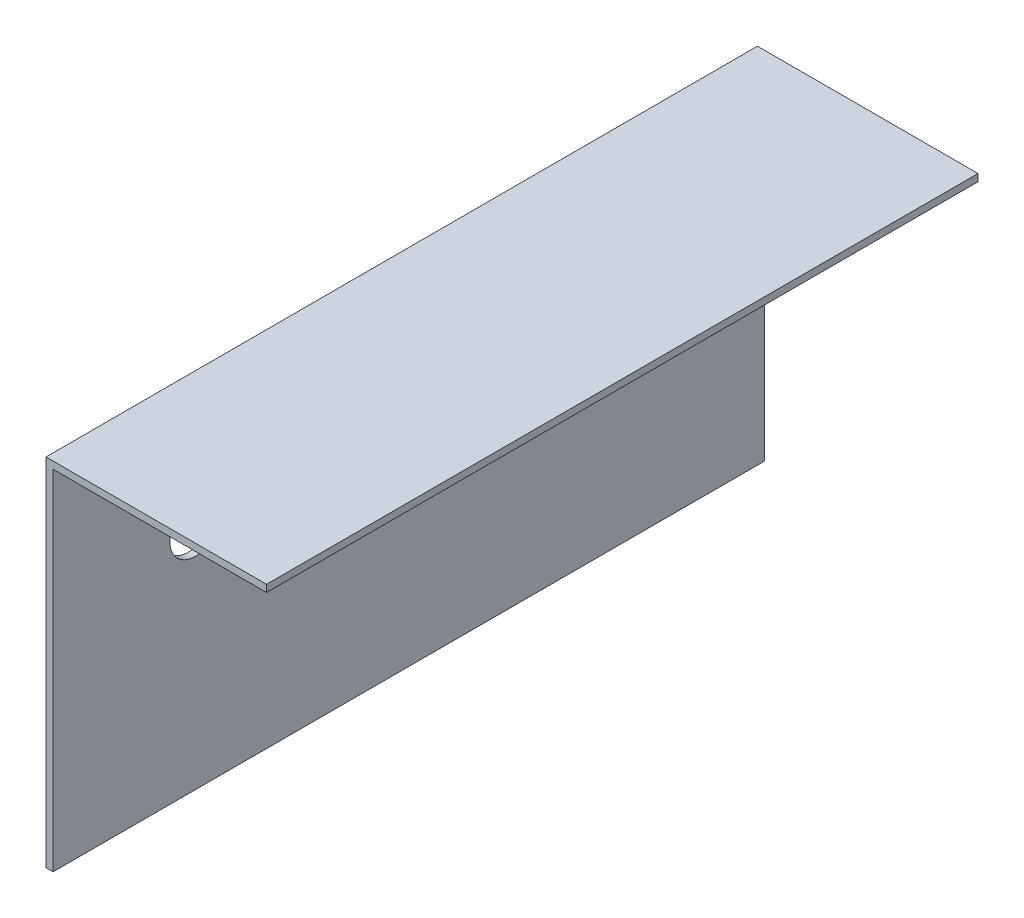
ISO-10303-21;
HEADER;
FILE_DESCRIPTION(('STEP AP214'),'2;1');
FILE_NAME('part.step','',(''),(''),'','','');
FILE_SCHEMA(('AUTOMOTIVE_DESIGN { 1 0 10303 214 1 1 1 1 }'));
ENDSEC;
DATA;
#1=APPLICATION_CONTEXT('core data for automotive mechanical design processes');
#2=APPLICATION_PROTOCOL_DEFINITION('international standard','automotive_design',2000,#1);
#3=PRODUCT_CONTEXT('',#1,'mechanical');
#4=PRODUCT('Part','Part','',(#3));
#5=PRODUCT_RELATED_PRODUCT_CATEGORY('part','',(#4));
#6=PRODUCT_DEFINITION_FORMATION('','',#4);
#7=PRODUCT_DEFINITION_CONTEXT('part definition',#1,'design');
#8=PRODUCT_DEFINITION('design','',#6,#7);
#9=PRODUCT_DEFINITION_SHAPE('','',#8);
#10=(LENGTH_UNIT() NAMED_UNIT(*) SI_UNIT(.MILLI.,.METRE.));
#11=(NAMED_UNIT(*) PLANE_ANGLE_UNIT() SI_UNIT($,.RADIAN.));
#12=(NAMED_UNIT(*) SI_UNIT($,.STERADIAN.) SOLID_ANGLE_UNIT());
#13=UNCERTAINTY_MEASURE_WITH_UNIT(LENGTH_MEASURE(1.E-05),#10,'distance_accuracy_value','');
#14=(GEOMETRIC_REPRESENTATION_CONTEXT(3) GLOBAL_UNCERTAINTY_ASSIGNED_CONTEXT((#13)) GLOBAL_UNIT_ASSIGNED_CONTEXT((#10,
#11,#12)) REPRESENTATION_CONTEXT('',''));
#15=CARTESIAN_POINT('',(0.,0.,0.));
#16=DIRECTION('',(0.,0.,1.));
#17=DIRECTION('',(1.,0.,0.));
#18=AXIS2_PLACEMENT_3D('',#15,#16,#17);
#19=CARTESIAN_POINT('',(0.5,22.5000422689563,56.9338086142651));
#20=DIRECTION('',(0.,0.,-1.));
#21=DIRECTION('',(0.,1.,0.));
#22=AXIS2_PLACEMENT_3D('',#19,#20,#21);
#23=PLANE('',#22);
#24=DIRECTION('',(0.,-1.,0.));
#25=VECTOR('',#24,1.);
#26=CARTESIAN_POINT('',(0.,22.5000422689563,56.9338086142651));
#27=LINE('',#26,#25);
#28=CARTESIAN_POINT('',(0.,22.5000422689563,56.9338086142651));
#29=VERTEX_POINT('',#28);
#30=CARTESIAN_POINT('',(0.,-2.49995773104371,56.9338086142651));
#31=VERTEX_POINT('',#30);
#32=EDGE_CURVE('E93',#29,#31,#27,.T.);
#33=ORIENTED_EDGE('',*,*,#32,.T.);
#34=DIRECTION('',(-1.,0.,0.));
#35=VECTOR('',#34,1.);
#36=CARTESIAN_POINT('',(0.5,-2.49995773104371,56.9338086142651));
#37=LINE('',#36,#35);
#38=CARTESIAN_POINT('',(0.5,-2.49995773104371,56.9338086142651));
#39=VERTEX_POINT('',#38);
#40=EDGE_CURVE('E11',#39,#31,#37,.T.);
#41=ORIENTED_EDGE('',*,*,#40,.F.);
#42=DIRECTION('',(0.,-1.,0.));
#43=VECTOR('',#42,1.);
#44=CARTESIAN_POINT('',(0.5,22.5000422689563,56.9338086142651));
#45=LINE('',#44,#43);
#46=CARTESIAN_POINT('',(0.5,22.0000422689563,56.9338086142651));
#47=VERTEX_POINT('',#46);
#48=EDGE_CURVE('E86',#47,#39,#45,.T.);
#49=ORIENTED_EDGE('',*,*,#48,.F.);
#50=DIRECTION('',(-1.,0.,0.));
#51=VECTOR('',#50,1.);
#52=CARTESIAN_POINT('',(15.5,22.0000422689563,56.9338086142651));
#53=LINE('',#52,#51);
#54=CARTESIAN_POINT('',(15.5,22.0000422689563,56.9338086142651));
#55=VERTEX_POINT('',#54);
#56=EDGE_CURVE('E101',#55,#47,#53,.T.);
#57=ORIENTED_EDGE('',*,*,#56,.F.);
#58=DIRECTION('',(0.,-1.,0.));
#59=VECTOR('',#58,1.);
#60=CARTESIAN_POINT('',(15.5,22.5000422689563,56.9338086142651));
#61=LINE('',#60,#59);
#62=CARTESIAN_POINT('',(15.5,22.5000422689563,56.9338086142651));
#63=VERTEX_POINT('',#62);
#64=EDGE_CURVE('E96',#63,#55,#61,.T.);
#65=ORIENTED_EDGE('',*,*,#64,.F.);
#66=DIRECTION('',(-1.,0.,0.));
#67=VECTOR('',#66,1.);
#68=CARTESIAN_POINT('',(0.5,22.5000422689563,56.9338086142651));
#69=LINE('',#68,#67);
#70=EDGE_CURVE('E79',#63,#29,#69,.T.);
#71=ORIENTED_EDGE('',*,*,#70,.T.);
#72=EDGE_LOOP('',(#33,#41,#49,#57,#65,#71));
#73=FACE_BOUND('',#72,.T.);
#74=ADVANCED_FACE('F33',(#73),#23,.F.);
#75=CARTESIAN_POINT('',(0.5,-2.49995773104371,56.9338086142651));
#76=DIRECTION('',(0.,1.,0.));
#77=DIRECTION('',(0.,0.,1.));
#78=AXIS2_PLACEMENT_3D('',#75,#76,#77);
#79=PLANE('',#78);
#80=DIRECTION('',(0.,0.,-1.));
#81=VECTOR('',#80,1.);
#82=CARTESIAN_POINT('',(0.,-2.49995773104371,56.9338086142651));
#83=LINE('',#82,#81);
#84=CARTESIAN_POINT('',(0.,-2.49995773104371,6.93380861426509));
#85=VERTEX_POINT('',#84);
#86=EDGE_CURVE('E100',#31,#85,#83,.T.);
#87=ORIENTED_EDGE('',*,*,#86,.T.);
#88=DIRECTION('',(-1.,0.,0.));
#89=VECTOR('',#88,1.);
#90=CARTESIAN_POINT('',(0.5,-2.49995773104371,6.93380861426509));
#91=LINE('',#90,#89);
#92=CARTESIAN_POINT('',(0.5,-2.49995773104371,6.93380861426509));
#93=VERTEX_POINT('',#92);
#94=EDGE_CURVE('E41',#93,#85,#91,.T.);
#95=ORIENTED_EDGE('',*,*,#94,.F.);
#96=DIRECTION('',(0.,0.,-1.));
#97=VECTOR('',#96,1.);
#98=CARTESIAN_POINT('',(0.5,-2.49995773104371,56.9338086142651));
#99=LINE('',#98,#97);
#100=EDGE_CURVE('E55',#39,#93,#99,.T.);
#101=ORIENTED_EDGE('',*,*,#100,.F.);
#102=ORIENTED_EDGE('',*,*,#40,.T.);
#103=EDGE_LOOP('',(#87,#95,#101,#102));
#104=FACE_BOUND('',#103,.T.);
#105=ADVANCED_FACE('F180',(#104),#79,.F.);
#106=CARTESIAN_POINT('',(0.5,22.5000422689563,6.93380861426509));
#107=DIRECTION('',(0.,0.,1.));
#108=DIRECTION('',(0.,-1.,0.));
#109=AXIS2_PLACEMENT_3D('',#106,#107,#108);
#110=PLANE('',#109);
#111=DIRECTION('',(0.,1.,0.));
#112=VECTOR('',#111,1.);
#113=CARTESIAN_POINT('',(0.,22.5000422689563,6.93380861426509));
#114=LINE('',#113,#112);
#115=CARTESIAN_POINT('',(0.,22.5000422689563,6.93380861426509));
#116=VERTEX_POINT('',#115);
#117=EDGE_CURVE('E87',#85,#116,#114,.T.);
#118=ORIENTED_EDGE('',*,*,#117,.T.);
#119=DIRECTION('',(-1.,0.,0.));
#120=VECTOR('',#119,1.);
#121=CARTESIAN_POINT('',(0.5,22.5000422689563,6.93380861426509));
#122=LINE('',#121,#120);
#123=CARTESIAN_POINT('',(15.5,22.5000422689563,6.93380861426509));
#124=VERTEX_POINT('',#123);
#125=EDGE_CURVE('E82',#124,#116,#122,.T.);
#126=ORIENTED_EDGE('',*,*,#125,.F.);
#127=DIRECTION('',(0.,1.,0.));
#128=VECTOR('',#127,1.);
#129=CARTESIAN_POINT('',(15.5,22.5000422689563,6.93380861426509));
#130=LINE('',#129,#128);
#131=CARTESIAN_POINT('',(15.5,22.0000422689563,6.93380861426509));
#132=VERTEX_POINT('',#131);
#133=EDGE_CURVE('E136',#132,#124,#130,.T.);
#134=ORIENTED_EDGE('',*,*,#133,.F.);
#135=DIRECTION('',(-1.,0.,0.));
#136=VECTOR('',#135,1.);
#137=CARTESIAN_POINT('',(15.5,22.0000422689563,6.93380861426509));
#138=LINE('',#137,#136);
#139=CARTESIAN_POINT('',(0.5,22.0000422689563,6.93380861426509));
#140=VERTEX_POINT('',#139);
#141=EDGE_CURVE('E105',#132,#140,#138,.T.);
#142=ORIENTED_EDGE('',*,*,#141,.T.);
#143=DIRECTION('',(0.,1.,0.));
#144=VECTOR('',#143,1.);
#145=CARTESIAN_POINT('',(0.5,22.5000422689563,6.93380861426509));
#146=LINE('',#145,#144);
#147=EDGE_CURVE('E97',#93,#140,#146,.T.);
#148=ORIENTED_EDGE('',*,*,#147,.F.);
#149=ORIENTED_EDGE('',*,*,#94,.T.);
#150=EDGE_LOOP('',(#118,#126,#134,#142,#148,#149));
#151=FACE_BOUND('',#150,.T.);
#152=ADVANCED_FACE('F134',(#151),#110,.F.);
#153=CARTESIAN_POINT('',(0.5,22.5000422689563,56.9338086142651));
#154=DIRECTION('',(0.,-1.,0.));
#155=DIRECTION('',(0.,0.,-1.));
#156=AXIS2_PLACEMENT_3D('',#153,#154,#155);
#157=PLANE('',#156);
#158=DIRECTION('',(0.,0.,1.));
#159=VECTOR('',#158,1.);
#160=CARTESIAN_POINT('',(0.,22.5000422689563,56.9338086142651));
#161=LINE('',#160,#159);
#162=EDGE_CURVE('E75',#116,#29,#161,.T.);
#163=ORIENTED_EDGE('',*,*,#162,.T.);
#164=ORIENTED_EDGE('',*,*,#70,.F.);
#165=DIRECTION('',(0.,0.,1.));
#166=VECTOR('',#165,1.);
#167=CARTESIAN_POINT('',(15.5,22.5000422689563,56.9338086142651));
#168=LINE('',#167,#166);
#169=EDGE_CURVE('E137',#124,#63,#168,.T.);
#170=ORIENTED_EDGE('',*,*,#169,.F.);
#171=ORIENTED_EDGE('',*,*,#125,.T.);
#172=EDGE_LOOP('',(#163,#164,#170,#171));
#173=FACE_BOUND('',#172,.T.);
#174=ADVANCED_FACE('F77',(#173),#157,.F.);
#175=CARTESIAN_POINT('',(0.5,0.,0.));
#176=DIRECTION('',(1.,0.,0.));
#177=DIRECTION('',(0.,0.,-1.));
#178=AXIS2_PLACEMENT_3D('',#175,#176,#177);
#179=PLANE('',#178);
#180=CARTESIAN_POINT('',(0.5,13.5000422689563,46.9338086142651));
#181=DIRECTION('',(1.,0.,0.));
#182=DIRECTION('',(0.,0.,-1.));
#183=AXIS2_PLACEMENT_3D('',#180,#181,#182);
#184=CIRCLE('',#183,1.8);
#185=CARTESIAN_POINT('',(0.5,13.5000422689563,45.1338086142651));
#186=VERTEX_POINT('',#185);
#187=EDGE_CURVE('E153',#186,#186,#184,.T.);
#188=ORIENTED_EDGE('',*,*,#187,.F.);
#189=EDGE_LOOP('',(#188));
#190=FACE_BOUND('',#189,.T.);
#191=CARTESIAN_POINT('',(0.5,13.5000422689563,16.9338086142651));
#192=DIRECTION('',(1.,0.,0.));
#193=DIRECTION('',(0.,0.,-1.));
#194=AXIS2_PLACEMENT_3D('',#191,#192,#193);
#195=CIRCLE('',#194,1.8);
#196=CARTESIAN_POINT('',(0.5,13.5000422689563,15.1338086142651));
#197=VERTEX_POINT('',#196);
#198=EDGE_CURVE('E133',#197,#197,#195,.T.);
#199=ORIENTED_EDGE('',*,*,#198,.F.);
#200=EDGE_LOOP('',(#199));
#201=FACE_BOUND('',#200,.T.);
#202=DIRECTION('',(0.,0.,-1.));
#203=VECTOR('',#202,1.);
#204=CARTESIAN_POINT('',(0.5,22.0000422689563,56.9338086142651));
#205=LINE('',#204,#203);
#206=EDGE_CURVE('E49',#47,#140,#205,.T.);
#207=ORIENTED_EDGE('',*,*,#206,.F.);
#208=ORIENTED_EDGE('',*,*,#48,.T.);
#209=ORIENTED_EDGE('',*,*,#100,.T.);
#210=ORIENTED_EDGE('',*,*,#147,.T.);
#211=EDGE_LOOP('',(#207,#208,#209,#210));
#212=FACE_BOUND('',#211,.T.);
#213=ADVANCED_FACE('F123',(#190,#201,#212),#179,.T.);
#214=CARTESIAN_POINT('',(0.,0.,0.));
#215=DIRECTION('',(1.,0.,0.));
#216=DIRECTION('',(0.,0.,-1.));
#217=AXIS2_PLACEMENT_3D('',#214,#215,#216);
#218=PLANE('',#217);
#219=CARTESIAN_POINT('',(0.,13.5000422689563,46.9338086142651));
#220=DIRECTION('',(-1.,0.,0.));
#221=DIRECTION('',(0.,0.,1.));
#222=AXIS2_PLACEMENT_3D('',#219,#220,#221);
#223=CIRCLE('',#222,1.8);
#224=CARTESIAN_POINT('',(0.,13.5000422689563,48.7338086142651));
#225=VERTEX_POINT('',#224);
#226=EDGE_CURVE('E156',#225,#225,#223,.T.);
#227=ORIENTED_EDGE('',*,*,#226,.F.);
#228=EDGE_LOOP('',(#227));
#229=FACE_BOUND('',#228,.T.);
#230=CARTESIAN_POINT('',(0.,13.5000422689563,16.9338086142651));
#231=DIRECTION('',(-1.,0.,0.));
#232=DIRECTION('',(0.,0.,1.));
#233=AXIS2_PLACEMENT_3D('',#230,#231,#232);
#234=CIRCLE('',#233,1.8);
#235=CARTESIAN_POINT('',(0.,13.5000422689563,18.7338086142651));
#236=VERTEX_POINT('',#235);
#237=EDGE_CURVE('E150',#236,#236,#234,.T.);
#238=ORIENTED_EDGE('',*,*,#237,.F.);
#239=EDGE_LOOP('',(#238));
#240=FACE_BOUND('',#239,.T.);
#241=ORIENTED_EDGE('',*,*,#32,.F.);
#242=ORIENTED_EDGE('',*,*,#162,.F.);
#243=ORIENTED_EDGE('',*,*,#117,.F.);
#244=ORIENTED_EDGE('',*,*,#86,.F.);
#245=EDGE_LOOP('',(#241,#242,#243,#244));
#246=FACE_BOUND('',#245,.T.);
#247=ADVANCED_FACE('F99',(#229,#240,#246),#218,.F.);
#248=CARTESIAN_POINT('',(15.5,22.0000422689563,56.9338086142651));
#249=DIRECTION('',(0.,1.,0.));
#250=DIRECTION('',(0.,0.,1.));
#251=AXIS2_PLACEMENT_3D('',#248,#249,#250);
#252=PLANE('',#251);
#253=ORIENTED_EDGE('',*,*,#206,.T.);
#254=ORIENTED_EDGE('',*,*,#141,.F.);
#255=DIRECTION('',(0.,0.,-1.));
#256=VECTOR('',#255,1.);
#257=CARTESIAN_POINT('',(15.5,22.0000422689563,56.9338086142651));
#258=LINE('',#257,#256);
#259=EDGE_CURVE('E142',#55,#132,#258,.T.);
#260=ORIENTED_EDGE('',*,*,#259,.F.);
#261=ORIENTED_EDGE('',*,*,#56,.T.);
#262=EDGE_LOOP('',(#253,#254,#260,#261));
#263=FACE_BOUND('',#262,.T.);
#264=ADVANCED_FACE('F129',(#263),#252,.F.);
#265=CARTESIAN_POINT('',(15.5,0.,0.));
#266=DIRECTION('',(1.,0.,0.));
#267=DIRECTION('',(0.,0.,-1.));
#268=AXIS2_PLACEMENT_3D('',#265,#266,#267);
#269=PLANE('',#268);
#270=ORIENTED_EDGE('',*,*,#64,.T.);
#271=ORIENTED_EDGE('',*,*,#259,.T.);
#272=ORIENTED_EDGE('',*,*,#133,.T.);
#273=ORIENTED_EDGE('',*,*,#169,.T.);
#274=EDGE_LOOP('',(#270,#271,#272,#273));
#275=FACE_BOUND('',#274,.T.);
#276=ADVANCED_FACE('F169',(#275),#269,.T.);
#277=CARTESIAN_POINT('',(0.,13.5000422689563,16.9338086142651));
#278=DIRECTION('',(-1.,0.,0.));
#279=DIRECTION('',(0.,0.,1.));
#280=AXIS2_PLACEMENT_3D('',#277,#278,#279);
#281=CYLINDRICAL_SURFACE('',#280,1.8);
#282=ORIENTED_EDGE('',*,*,#198,.T.);
#283=EDGE_LOOP('',(#282));
#284=FACE_BOUND('',#283,.T.);
#285=ORIENTED_EDGE('',*,*,#237,.T.);
#286=EDGE_LOOP('',(#285));
#287=FACE_BOUND('',#286,.T.);
#288=ADVANCED_FACE('F167',(#284,#287),#281,.F.);
#289=CARTESIAN_POINT('',(0.,13.5000422689563,46.9338086142651));
#290=DIRECTION('',(-1.,0.,0.));
#291=DIRECTION('',(0.,0.,1.));
#292=AXIS2_PLACEMENT_3D('',#289,#290,#291);
#293=CYLINDRICAL_SURFACE('',#292,1.8);
#294=ORIENTED_EDGE('',*,*,#187,.T.);
#295=EDGE_LOOP('',(#294));
#296=FACE_BOUND('',#295,.T.);
#297=ORIENTED_EDGE('',*,*,#226,.T.);
#298=EDGE_LOOP('',(#297));
#299=FACE_BOUND('',#298,.T.);
#300=ADVANCED_FACE('F160',(#296,#299),#293,.F.);
#301=CLOSED_SHELL('',(#74,#105,#152,#174,#213,#247,#264,#276,#288,#300));
#302=MANIFOLD_SOLID_BREP('B2',#301);
#303=ADVANCED_BREP_SHAPE_REPRESENTATION('',(#18,#302),#14);
#304=SHAPE_DEFINITION_REPRESENTATION(#9,#303);
ENDSEC;
END-ISO-10303-21;
